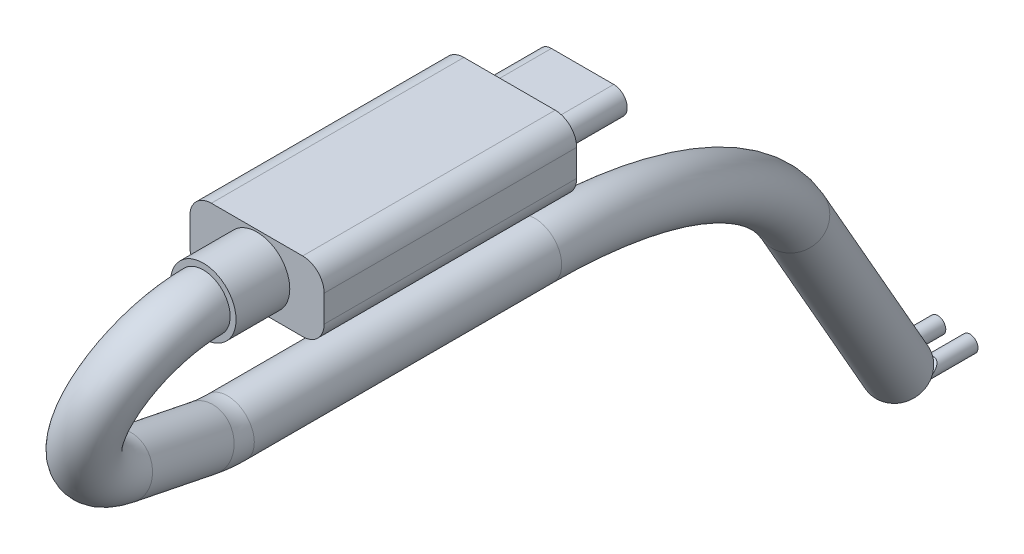
ISO-10303-21;
HEADER;
FILE_DESCRIPTION(('STEP AP214'),'2;1');
FILE_NAME('part.step','',(''),(''),'','','');
FILE_SCHEMA(('AUTOMOTIVE_DESIGN { 1 0 10303 214 1 1 1 1 }'));
ENDSEC;
DATA;
#1=APPLICATION_CONTEXT('core data for automotive mechanical design processes');
#2=APPLICATION_PROTOCOL_DEFINITION('international standard','automotive_design',2000,#1);
#3=PRODUCT_CONTEXT('',#1,'mechanical');
#4=PRODUCT('Part','Part','',(#3));
#5=PRODUCT_RELATED_PRODUCT_CATEGORY('part','',(#4));
#6=PRODUCT_DEFINITION_FORMATION('','',#4);
#7=PRODUCT_DEFINITION_CONTEXT('part definition',#1,'design');
#8=PRODUCT_DEFINITION('design','',#6,#7);
#9=PRODUCT_DEFINITION_SHAPE('','',#8);
#10=(LENGTH_UNIT() NAMED_UNIT(*) SI_UNIT(.MILLI.,.METRE.));
#11=(NAMED_UNIT(*) PLANE_ANGLE_UNIT() SI_UNIT($,.RADIAN.));
#12=(NAMED_UNIT(*) SI_UNIT($,.STERADIAN.) SOLID_ANGLE_UNIT());
#13=UNCERTAINTY_MEASURE_WITH_UNIT(LENGTH_MEASURE(1.E-05),#10,'distance_accuracy_value','');
#14=(GEOMETRIC_REPRESENTATION_CONTEXT(3) GLOBAL_UNCERTAINTY_ASSIGNED_CONTEXT((#13)) GLOBAL_UNIT_ASSIGNED_CONTEXT((#10,
#11,#12)) REPRESENTATION_CONTEXT('',''));
#15=CARTESIAN_POINT('',(0.,0.,0.));
#16=DIRECTION('',(0.,0.,1.));
#17=DIRECTION('',(1.,0.,0.));
#18=AXIS2_PLACEMENT_3D('',#15,#16,#17);
#19=CARTESIAN_POINT('',(-22.1484523727716,-58.2448093046502,-64.166177989966));
#20=DIRECTION('',(0.,0.,1.));
#21=DIRECTION('',(1.,0.,0.));
#22=AXIS2_PLACEMENT_3D('',#19,#20,#21);
#23=CYLINDRICAL_SURFACE('',#22,0.749999999999999);
#24=CARTESIAN_POINT('',(-22.3990542849047,-58.951702989468,-54.827923588188));
#25=CARTESIAN_POINT('',(-23.8128416545402,-58.4504991652018,-54.827923588188));
#26=CARTESIAN_POINT('',(-23.311637830274,-57.0367117955663,-57.0301176485129));
#27=CARTESIAN_POINT('',(-21.8978504606385,-57.5379156198325,-57.0301176485129));
#28=CARTESIAN_POINT('',(-20.484063091003,-58.0391194440987,-57.0301176485129));
#29=CARTESIAN_POINT('',(-20.9852669152692,-59.4529068137342,-54.827923588188));
#30=CARTESIAN_POINT('',(-22.3990542849047,-58.951702989468,-54.827923588188));
#31=(BOUNDED_CURVE() B_SPLINE_CURVE(3,(#24,#25,#26,#27,#28,#29,#30),.UNSPECIFIED.,.T.,
.F.) B_SPLINE_CURVE_WITH_KNOTS((4,3,4),(0.,0.5,1.),
.UNSPECIFIED.) CURVE() GEOMETRIC_REPRESENTATION_ITEM() RATIONAL_B_SPLINE_CURVE((1.,
0.333333333333333,0.333333333333333,1.,0.333333333333333,0.333333333333333,1.)) REPRESENTATION_ITEM(''));
#32=CARTESIAN_POINT('',(-22.3990542849047,-58.951702989468,-54.827923588188));
#33=VERTEX_POINT('',#32);
#34=EDGE_CURVE('E60',#33,#33,#31,.T.);
#35=ORIENTED_EDGE('',*,*,#34,.T.);
#36=EDGE_LOOP('',(#35));
#37=FACE_BOUND('',#36,.T.);
#38=CARTESIAN_POINT('',(-22.1484523727716,-58.2448093046502,-62.));
#39=DIRECTION('',(0.,0.,-1.));
#40=DIRECTION('',(-1.,0.,0.));
#41=AXIS2_PLACEMENT_3D('',#38,#39,#40);
#42=CIRCLE('',#41,0.749999999999999);
#43=CARTESIAN_POINT('',(-22.8984523727716,-58.2448093046502,-62.));
#44=VERTEX_POINT('',#43);
#45=EDGE_CURVE('E11',#44,#44,#42,.T.);
#46=ORIENTED_EDGE('',*,*,#45,.F.);
#47=EDGE_LOOP('',(#46));
#48=FACE_BOUND('',#47,.T.);
#49=ADVANCED_FACE('F53',(#37,#48),#23,.T.);
#50=CARTESIAN_POINT('',(-21.8978504606385,-57.5379156198325,-57.0301176485129));
#51=DIRECTION('',(0.276159487991269,0.778986067591778,0.562953500468998));
#52=DIRECTION('',(0.,-0.585731531678634,0.81050513434364));
#53=AXIS2_PLACEMENT_3D('',#50,#51,#52);
#54=PLANE('',#53);
#55=ORIENTED_EDGE('',*,*,#34,.F.);
#56=EDGE_LOOP('',(#55));
#57=FACE_BOUND('',#56,.T.);
#58=ADVANCED_FACE('F73',(#57),#54,.T.);
#59=CARTESIAN_POINT('',(0.,0.,-62.));
#60=DIRECTION('',(0.,0.,-1.));
#61=DIRECTION('',(-1.,0.,0.));
#62=AXIS2_PLACEMENT_3D('',#59,#60,#61);
#63=PLANE('',#62);
#64=ORIENTED_EDGE('',*,*,#45,.T.);
#65=EDGE_LOOP('',(#64));
#66=FACE_BOUND('',#65,.T.);
#67=ADVANCED_FACE('F55',(#66),#63,.T.);
#68=CLOSED_SHELL('',(#49,#58,#67));
#69=MANIFOLD_SOLID_BREP('B2',#68);
#70=CARTESIAN_POINT('',(-19.1484523727716,-58.2448093046502,-65.6378421025803));
#71=DIRECTION('',(0.,0.,1.));
#72=DIRECTION('',(1.,0.,0.));
#73=AXIS2_PLACEMENT_3D('',#70,#71,#72);
#74=CYLINDRICAL_SURFACE('',#73,0.749999999999999);
#75=CARTESIAN_POINT('',(-19.3990542849047,-58.951702989468,-56.2995877008023));
#76=CARTESIAN_POINT('',(-20.8128416545402,-58.4504991652018,-56.2995877008023));
#77=CARTESIAN_POINT('',(-20.311637830274,-57.0367117955663,-58.5017817611271));
#78=CARTESIAN_POINT('',(-18.8978504606385,-57.5379156198325,-58.5017817611271));
#79=CARTESIAN_POINT('',(-17.484063091003,-58.0391194440987,-58.5017817611271));
#80=CARTESIAN_POINT('',(-17.9852669152692,-59.4529068137342,-56.2995877008023));
#81=CARTESIAN_POINT('',(-19.3990542849047,-58.951702989468,-56.2995877008023));
#82=(BOUNDED_CURVE() B_SPLINE_CURVE(3,(#75,#76,#77,#78,#79,#80,#81),.UNSPECIFIED.,.T.,
.F.) B_SPLINE_CURVE_WITH_KNOTS((4,3,4),(0.,0.5,1.),
.UNSPECIFIED.) CURVE() GEOMETRIC_REPRESENTATION_ITEM() RATIONAL_B_SPLINE_CURVE((1.,
0.333333333333333,0.333333333333333,1.,0.333333333333333,0.333333333333333,1.)) REPRESENTATION_ITEM(''));
#83=CARTESIAN_POINT('',(-19.3990542849047,-58.951702989468,-56.2995877008023));
#84=VERTEX_POINT('',#83);
#85=EDGE_CURVE('E114',#84,#84,#82,.T.);
#86=ORIENTED_EDGE('',*,*,#85,.T.);
#87=EDGE_LOOP('',(#86));
#88=FACE_BOUND('',#87,.T.);
#89=CARTESIAN_POINT('',(-19.1484523727716,-58.2448093046502,-62.));
#90=DIRECTION('',(0.,0.,-1.));
#91=DIRECTION('',(-1.,0.,0.));
#92=AXIS2_PLACEMENT_3D('',#89,#90,#91);
#93=CIRCLE('',#92,0.749999999999999);
#94=CARTESIAN_POINT('',(-19.8984523727716,-58.2448093046502,-62.));
#95=VERTEX_POINT('',#94);
#96=EDGE_CURVE('E52',#95,#95,#93,.T.);
#97=ORIENTED_EDGE('',*,*,#96,.F.);
#98=EDGE_LOOP('',(#97));
#99=FACE_BOUND('',#98,.T.);
#100=ADVANCED_FACE('F107',(#88,#99),#74,.T.);
#101=CARTESIAN_POINT('',(-18.8978504606385,-57.5379156198325,-58.5017817611271));
#102=DIRECTION('',(0.276159487991267,0.778986067591777,0.562953500469));
#103=DIRECTION('',(0.,-0.585731531678636,0.810505134343638));
#104=AXIS2_PLACEMENT_3D('',#101,#102,#103);
#105=PLANE('',#104);
#106=ORIENTED_EDGE('',*,*,#85,.F.);
#107=EDGE_LOOP('',(#106));
#108=FACE_BOUND('',#107,.T.);
#109=ADVANCED_FACE('F127',(#108),#105,.T.);
#110=CARTESIAN_POINT('',(0.,0.,-62.));
#111=DIRECTION('',(0.,0.,-1.));
#112=DIRECTION('',(-1.,0.,0.));
#113=AXIS2_PLACEMENT_3D('',#110,#111,#112);
#114=PLANE('',#113);
#115=ORIENTED_EDGE('',*,*,#96,.T.);
#116=EDGE_LOOP('',(#115));
#117=FACE_BOUND('',#116,.T.);
#118=ADVANCED_FACE('F109',(#117),#114,.T.);
#119=CLOSED_SHELL('',(#100,#109,#118));
#120=MANIFOLD_SOLID_BREP('B6',#119);
#121=CARTESIAN_POINT('',(-2.9,0.,-6.8));
#122=DIRECTION('',(0.,0.,1.));
#123=DIRECTION('',(1.,0.,0.));
#124=AXIS2_PLACEMENT_3D('',#121,#122,#123);
#125=CYLINDRICAL_SURFACE('',#124,1.25);
#126=DIRECTION('',(0.,0.,1.));
#127=VECTOR('',#126,1.);
#128=CARTESIAN_POINT('',(-2.9,1.25,-6.8));
#129=LINE('',#128,#127);
#130=CARTESIAN_POINT('',(-2.9,1.25,-6.8));
#131=VERTEX_POINT('',#130);
#132=CARTESIAN_POINT('',(-2.9,1.25,0.));
#133=VERTEX_POINT('',#132);
#134=EDGE_CURVE('E297',#131,#133,#129,.T.);
#135=ORIENTED_EDGE('',*,*,#134,.F.);
#136=CARTESIAN_POINT('',(-2.9,0.,-6.8));
#137=DIRECTION('',(0.,0.,-1.));
#138=DIRECTION('',(-1.,0.,0.));
#139=AXIS2_PLACEMENT_3D('',#136,#137,#138);
#140=CIRCLE('',#139,1.25);
#141=CARTESIAN_POINT('',(-2.9,-1.25,-6.8));
#142=VERTEX_POINT('',#141);
#143=EDGE_CURVE('E303',#142,#131,#140,.T.);
#144=ORIENTED_EDGE('',*,*,#143,.F.);
#145=DIRECTION('',(0.,0.,1.));
#146=VECTOR('',#145,1.);
#147=CARTESIAN_POINT('',(-2.9,-1.25,-6.8));
#148=LINE('',#147,#146);
#149=CARTESIAN_POINT('',(-2.9,-1.25,0.));
#150=VERTEX_POINT('',#149);
#151=EDGE_CURVE('E300',#150,#142,#148,.F.);
#152=ORIENTED_EDGE('',*,*,#151,.F.);
#153=CARTESIAN_POINT('',(-2.9,0.,0.));
#154=DIRECTION('',(0.,0.,-1.));
#155=DIRECTION('',(-1.,0.,0.));
#156=AXIS2_PLACEMENT_3D('',#153,#154,#155);
#157=CIRCLE('',#156,1.25);
#158=EDGE_CURVE('E305',#150,#133,#157,.T.);
#159=ORIENTED_EDGE('',*,*,#158,.T.);
#160=EDGE_LOOP('',(#135,#144,#152,#159));
#161=FACE_BOUND('',#160,.T.);
#162=ADVANCED_FACE('F152',(#161),#125,.T.);
#163=CARTESIAN_POINT('',(2.9,0.,0.));
#164=DIRECTION('',(0.,0.,1.));
#165=DIRECTION('',(1.,0.,0.));
#166=AXIS2_PLACEMENT_3D('',#163,#164,#165);
#167=CYLINDRICAL_SURFACE('',#166,1.25);
#168=DIRECTION('',(0.,0.,1.));
#169=VECTOR('',#168,1.);
#170=CARTESIAN_POINT('',(2.9,1.25,-6.8));
#171=LINE('',#170,#169);
#172=CARTESIAN_POINT('',(2.9,1.25,0.));
#173=VERTEX_POINT('',#172);
#174=CARTESIAN_POINT('',(2.9,1.25,-6.8));
#175=VERTEX_POINT('',#174);
#176=EDGE_CURVE('E285',#173,#175,#171,.F.);
#177=ORIENTED_EDGE('',*,*,#176,.F.);
#178=CARTESIAN_POINT('',(2.9,0.,0.));
#179=DIRECTION('',(0.,0.,-1.));
#180=DIRECTION('',(-1.,0.,0.));
#181=AXIS2_PLACEMENT_3D('',#178,#179,#180);
#182=CIRCLE('',#181,1.25);
#183=CARTESIAN_POINT('',(2.9,-1.25,0.));
#184=VERTEX_POINT('',#183);
#185=EDGE_CURVE('E294',#173,#184,#182,.T.);
#186=ORIENTED_EDGE('',*,*,#185,.T.);
#187=DIRECTION('',(0.,0.,1.));
#188=VECTOR('',#187,1.);
#189=CARTESIAN_POINT('',(2.9,-1.25,-6.8));
#190=LINE('',#189,#188);
#191=CARTESIAN_POINT('',(2.9,-1.25,-6.8));
#192=VERTEX_POINT('',#191);
#193=EDGE_CURVE('E288',#192,#184,#190,.T.);
#194=ORIENTED_EDGE('',*,*,#193,.F.);
#195=CARTESIAN_POINT('',(2.9,0.,-6.8));
#196=DIRECTION('',(0.,0.,-1.));
#197=DIRECTION('',(-1.,0.,0.));
#198=AXIS2_PLACEMENT_3D('',#195,#196,#197);
#199=CIRCLE('',#198,1.25);
#200=EDGE_CURVE('E291',#175,#192,#199,.T.);
#201=ORIENTED_EDGE('',*,*,#200,.F.);
#202=EDGE_LOOP('',(#177,#186,#194,#201));
#203=FACE_BOUND('',#202,.T.);
#204=ADVANCED_FACE('F376',(#203),#167,.T.);
#205=CARTESIAN_POINT('',(0.,0.,0.));
#206=DIRECTION('',(0.,0.,-1.));
#207=DIRECTION('',(-1.,0.,0.));
#208=AXIS2_PLACEMENT_3D('',#205,#206,#207);
#209=PLANE('',#208);
#210=ORIENTED_EDGE('',*,*,#158,.F.);
#211=DIRECTION('',(1.,0.,0.));
#212=VECTOR('',#211,1.);
#213=CARTESIAN_POINT('',(-4.15,-1.25,0.));
#214=LINE('',#213,#212);
#215=EDGE_CURVE('E594',#150,#184,#214,.T.);
#216=ORIENTED_EDGE('',*,*,#215,.T.);
#217=ORIENTED_EDGE('',*,*,#185,.F.);
#218=DIRECTION('',(-1.,0.,0.));
#219=VECTOR('',#218,1.);
#220=CARTESIAN_POINT('',(-4.15,1.25,0.));
#221=LINE('',#220,#219);
#222=EDGE_CURVE('E596',#173,#133,#221,.T.);
#223=ORIENTED_EDGE('',*,*,#222,.T.);
#224=EDGE_LOOP('',(#210,#216,#217,#223));
#225=FACE_BOUND('',#224,.T.);
#226=DIRECTION('',(0.,-1.,0.));
#227=VECTOR('',#226,1.);
#228=CARTESIAN_POINT('',(-6.25,-3.25,0.));
#229=LINE('',#228,#227);
#230=CARTESIAN_POINT('',(-6.25,1.25,0.));
#231=VERTEX_POINT('',#230);
#232=CARTESIAN_POINT('',(-6.25,-1.25,0.));
#233=VERTEX_POINT('',#232);
#234=EDGE_CURVE('E279',#231,#233,#229,.T.);
#235=ORIENTED_EDGE('',*,*,#234,.F.);
#236=CARTESIAN_POINT('',(-4.25,1.25,0.));
#237=DIRECTION('',(0.,0.,-1.));
#238=DIRECTION('',(-1.,0.,0.));
#239=AXIS2_PLACEMENT_3D('',#236,#237,#238);
#240=CIRCLE('',#239,2.);
#241=CARTESIAN_POINT('',(-4.25,3.25,0.));
#242=VERTEX_POINT('',#241);
#243=EDGE_CURVE('E318',#231,#242,#240,.T.);
#244=ORIENTED_EDGE('',*,*,#243,.T.);
#245=DIRECTION('',(-1.,0.,0.));
#246=VECTOR('',#245,1.);
#247=CARTESIAN_POINT('',(-6.25,3.25,0.));
#248=LINE('',#247,#246);
#249=CARTESIAN_POINT('',(4.25,3.25,0.));
#250=VERTEX_POINT('',#249);
#251=EDGE_CURVE('E276',#250,#242,#248,.T.);
#252=ORIENTED_EDGE('',*,*,#251,.F.);
#253=CARTESIAN_POINT('',(4.25,1.25,0.));
#254=DIRECTION('',(0.,0.,-1.));
#255=DIRECTION('',(-1.,0.,0.));
#256=AXIS2_PLACEMENT_3D('',#253,#254,#255);
#257=CIRCLE('',#256,2.);
#258=CARTESIAN_POINT('',(6.25,1.25,0.));
#259=VERTEX_POINT('',#258);
#260=EDGE_CURVE('E312',#250,#259,#257,.T.);
#261=ORIENTED_EDGE('',*,*,#260,.T.);
#262=DIRECTION('',(0.,1.,0.));
#263=VECTOR('',#262,1.);
#264=CARTESIAN_POINT('',(6.25,-3.25,0.));
#265=LINE('',#264,#263);
#266=CARTESIAN_POINT('',(6.25,-1.25,0.));
#267=VERTEX_POINT('',#266);
#268=EDGE_CURVE('E252',#267,#259,#265,.T.);
#269=ORIENTED_EDGE('',*,*,#268,.F.);
#270=CARTESIAN_POINT('',(4.25,-1.25,0.));
#271=DIRECTION('',(0.,0.,-1.));
#272=DIRECTION('',(-1.,0.,0.));
#273=AXIS2_PLACEMENT_3D('',#270,#271,#272);
#274=CIRCLE('',#273,2.);
#275=CARTESIAN_POINT('',(4.25,-3.25,0.));
#276=VERTEX_POINT('',#275);
#277=EDGE_CURVE('E314',#267,#276,#274,.T.);
#278=ORIENTED_EDGE('',*,*,#277,.T.);
#279=DIRECTION('',(1.,0.,0.));
#280=VECTOR('',#279,1.);
#281=CARTESIAN_POINT('',(-6.25,-3.25,0.));
#282=LINE('',#281,#280);
#283=CARTESIAN_POINT('',(-4.25,-3.25,0.));
#284=VERTEX_POINT('',#283);
#285=EDGE_CURVE('E268',#284,#276,#282,.T.);
#286=ORIENTED_EDGE('',*,*,#285,.F.);
#287=CARTESIAN_POINT('',(-4.25,-1.25,0.));
#288=DIRECTION('',(0.,0.,-1.));
#289=DIRECTION('',(-1.,0.,0.));
#290=AXIS2_PLACEMENT_3D('',#287,#288,#289);
#291=CIRCLE('',#290,2.);
#292=EDGE_CURVE('E316',#284,#233,#291,.T.);
#293=ORIENTED_EDGE('',*,*,#292,.T.);
#294=EDGE_LOOP('',(#235,#244,#252,#261,#269,#278,#286,#293));
#295=FACE_BOUND('',#294,.T.);
#296=ADVANCED_FACE('F353',(#225,#295),#209,.T.);
#297=CARTESIAN_POINT('',(6.25,-3.25,23.5));
#298=DIRECTION('',(-1.,0.,0.));
#299=DIRECTION('',(0.,0.,1.));
#300=AXIS2_PLACEMENT_3D('',#297,#298,#299);
#301=PLANE('',#300);
#302=DIRECTION('',(0.,1.,0.));
#303=VECTOR('',#302,1.);
#304=CARTESIAN_POINT('',(6.25,-3.25,23.5));
#305=LINE('',#304,#303);
#306=CARTESIAN_POINT('',(6.25,-1.25,23.5));
#307=VERTEX_POINT('',#306);
#308=CARTESIAN_POINT('',(6.25,1.25,23.5));
#309=VERTEX_POINT('',#308);
#310=EDGE_CURVE('E264',#307,#309,#305,.T.);
#311=ORIENTED_EDGE('',*,*,#310,.F.);
#312=DIRECTION('',(0.,0.,-1.));
#313=VECTOR('',#312,1.);
#314=CARTESIAN_POINT('',(6.25,-1.25,23.5));
#315=LINE('',#314,#313);
#316=EDGE_CURVE('E105',#307,#267,#315,.T.);
#317=ORIENTED_EDGE('',*,*,#316,.T.);
#318=ORIENTED_EDGE('',*,*,#268,.T.);
#319=DIRECTION('',(0.,0.,-1.));
#320=VECTOR('',#319,1.);
#321=CARTESIAN_POINT('',(6.25,1.25,23.5));
#322=LINE('',#321,#320);
#323=EDGE_CURVE('E160',#259,#309,#322,.F.);
#324=ORIENTED_EDGE('',*,*,#323,.T.);
#325=EDGE_LOOP('',(#311,#317,#318,#324));
#326=FACE_BOUND('',#325,.T.);
#327=ADVANCED_FACE('F338',(#326),#301,.F.);
#328=CARTESIAN_POINT('',(-6.25000000000001,3.25,23.5));
#329=DIRECTION('',(0.,-1.,0.));
#330=DIRECTION('',(0.,0.,-1.));
#331=AXIS2_PLACEMENT_3D('',#328,#329,#330);
#332=PLANE('',#331);
#333=ORIENTED_EDGE('',*,*,#251,.T.);
#334=DIRECTION('',(0.,0.,-1.));
#335=VECTOR('',#334,1.);
#336=CARTESIAN_POINT('',(-4.25000000000001,3.25,23.5));
#337=LINE('',#336,#335);
#338=CARTESIAN_POINT('',(-4.25000000000001,3.25,23.5));
#339=VERTEX_POINT('',#338);
#340=EDGE_CURVE('E323',#242,#339,#337,.F.);
#341=ORIENTED_EDGE('',*,*,#340,.T.);
#342=DIRECTION('',(-1.,0.,0.));
#343=VECTOR('',#342,1.);
#344=CARTESIAN_POINT('',(-6.25000000000001,3.25,23.5));
#345=LINE('',#344,#343);
#346=CARTESIAN_POINT('',(4.25,3.25,23.5));
#347=VERTEX_POINT('',#346);
#348=EDGE_CURVE('E267',#347,#339,#345,.T.);
#349=ORIENTED_EDGE('',*,*,#348,.F.);
#350=DIRECTION('',(0.,0.,-1.));
#351=VECTOR('',#350,1.);
#352=CARTESIAN_POINT('',(4.25,3.25,23.5));
#353=LINE('',#352,#351);
#354=EDGE_CURVE('E320',#347,#250,#353,.T.);
#355=ORIENTED_EDGE('',*,*,#354,.T.);
#356=EDGE_LOOP('',(#333,#341,#349,#355));
#357=FACE_BOUND('',#356,.T.);
#358=ADVANCED_FACE('F349',(#357),#332,.F.);
#359=CARTESIAN_POINT('',(-6.25000000000001,-3.25,23.5));
#360=DIRECTION('',(1.,0.,0.));
#361=DIRECTION('',(0.,0.,-1.));
#362=AXIS2_PLACEMENT_3D('',#359,#360,#361);
#363=PLANE('',#362);
#364=DIRECTION('',(0.,-1.,0.));
#365=VECTOR('',#364,1.);
#366=CARTESIAN_POINT('',(-6.25000000000001,-3.25,23.5));
#367=LINE('',#366,#365);
#368=CARTESIAN_POINT('',(-6.25000000000001,1.25,23.5));
#369=VERTEX_POINT('',#368);
#370=CARTESIAN_POINT('',(-6.25000000000001,-1.25,23.5));
#371=VERTEX_POINT('',#370);
#372=EDGE_CURVE('E271',#369,#371,#367,.T.);
#373=ORIENTED_EDGE('',*,*,#372,.F.);
#374=DIRECTION('',(0.,0.,-1.));
#375=VECTOR('',#374,1.);
#376=CARTESIAN_POINT('',(-6.25000000000001,1.25,23.5));
#377=LINE('',#376,#375);
#378=EDGE_CURVE('E309',#369,#231,#377,.T.);
#379=ORIENTED_EDGE('',*,*,#378,.T.);
#380=ORIENTED_EDGE('',*,*,#234,.T.);
#381=DIRECTION('',(0.,0.,-1.));
#382=VECTOR('',#381,1.);
#383=CARTESIAN_POINT('',(-6.25000000000001,-1.25,23.5));
#384=LINE('',#383,#382);
#385=EDGE_CURVE('E307',#233,#371,#384,.F.);
#386=ORIENTED_EDGE('',*,*,#385,.T.);
#387=EDGE_LOOP('',(#373,#379,#380,#386));
#388=FACE_BOUND('',#387,.T.);
#389=ADVANCED_FACE('F360',(#388),#363,.F.);
#390=CARTESIAN_POINT('',(-6.25000000000001,-3.25,23.5));
#391=DIRECTION('',(0.,1.,0.));
#392=DIRECTION('',(0.,0.,1.));
#393=AXIS2_PLACEMENT_3D('',#390,#391,#392);
#394=PLANE('',#393);
#395=DIRECTION('',(1.,0.,0.));
#396=VECTOR('',#395,1.);
#397=CARTESIAN_POINT('',(-6.25000000000001,-3.25,23.5));
#398=LINE('',#397,#396);
#399=CARTESIAN_POINT('',(-4.25000000000001,-3.25,23.5));
#400=VERTEX_POINT('',#399);
#401=CARTESIAN_POINT('',(4.25,-3.25,23.5));
#402=VERTEX_POINT('',#401);
#403=EDGE_CURVE('E263',#400,#402,#398,.T.);
#404=ORIENTED_EDGE('',*,*,#403,.F.);
#405=DIRECTION('',(0.,0.,-1.));
#406=VECTOR('',#405,1.);
#407=CARTESIAN_POINT('',(-4.25000000000001,-3.25,23.5));
#408=LINE('',#407,#406);
#409=EDGE_CURVE('E333',#400,#284,#408,.T.);
#410=ORIENTED_EDGE('',*,*,#409,.T.);
#411=ORIENTED_EDGE('',*,*,#285,.T.);
#412=DIRECTION('',(0.,0.,-1.));
#413=VECTOR('',#412,1.);
#414=CARTESIAN_POINT('',(4.25,-3.25,23.5));
#415=LINE('',#414,#413);
#416=EDGE_CURVE('E167',#276,#402,#415,.F.);
#417=ORIENTED_EDGE('',*,*,#416,.T.);
#418=EDGE_LOOP('',(#404,#410,#411,#417));
#419=FACE_BOUND('',#418,.T.);
#420=ADVANCED_FACE('F366',(#419),#394,.F.);
#421=CARTESIAN_POINT('',(0.,0.,23.5));
#422=DIRECTION('',(0.,0.,-1.));
#423=DIRECTION('',(-1.,0.,0.));
#424=AXIS2_PLACEMENT_3D('',#421,#422,#423);
#425=PLANE('',#424);
#426=CARTESIAN_POINT('',(0.,0.,23.5));
#427=DIRECTION('',(0.,0.,1.));
#428=DIRECTION('',(1.,0.,0.));
#429=AXIS2_PLACEMENT_3D('',#426,#427,#428);
#430=CIRCLE('',#429,3.05);
#431=CARTESIAN_POINT('',(3.05,0.,23.5));
#432=VERTEX_POINT('',#431);
#433=EDGE_CURVE('E259',#432,#432,#430,.T.);
#434=ORIENTED_EDGE('',*,*,#433,.F.);
#435=EDGE_LOOP('',(#434));
#436=FACE_BOUND('',#435,.T.);
#437=ORIENTED_EDGE('',*,*,#348,.T.);
#438=CARTESIAN_POINT('',(-4.25000000000001,1.25,23.5));
#439=DIRECTION('',(0.,0.,-1.));
#440=DIRECTION('',(-1.,0.,0.));
#441=AXIS2_PLACEMENT_3D('',#438,#439,#440);
#442=CIRCLE('',#441,2.);
#443=EDGE_CURVE('E330',#339,#369,#442,.F.);
#444=ORIENTED_EDGE('',*,*,#443,.T.);
#445=ORIENTED_EDGE('',*,*,#372,.T.);
#446=CARTESIAN_POINT('',(-4.25000000000001,-1.25,23.5));
#447=DIRECTION('',(0.,0.,-1.));
#448=DIRECTION('',(-1.,0.,0.));
#449=AXIS2_PLACEMENT_3D('',#446,#447,#448);
#450=CIRCLE('',#449,2.);
#451=EDGE_CURVE('E174',#371,#400,#450,.F.);
#452=ORIENTED_EDGE('',*,*,#451,.T.);
#453=ORIENTED_EDGE('',*,*,#403,.T.);
#454=CARTESIAN_POINT('',(4.25,-1.25,23.5));
#455=DIRECTION('',(0.,0.,-1.));
#456=DIRECTION('',(-1.,0.,0.));
#457=AXIS2_PLACEMENT_3D('',#454,#455,#456);
#458=CIRCLE('',#457,2.);
#459=EDGE_CURVE('E327',#402,#307,#458,.F.);
#460=ORIENTED_EDGE('',*,*,#459,.T.);
#461=ORIENTED_EDGE('',*,*,#310,.T.);
#462=CARTESIAN_POINT('',(4.25,1.25,23.5));
#463=DIRECTION('',(0.,0.,-1.));
#464=DIRECTION('',(-1.,0.,0.));
#465=AXIS2_PLACEMENT_3D('',#462,#463,#464);
#466=CIRCLE('',#465,2.);
#467=EDGE_CURVE('E325',#309,#347,#466,.F.);
#468=ORIENTED_EDGE('',*,*,#467,.T.);
#469=EDGE_LOOP('',(#437,#444,#445,#452,#453,#460,#461,#468));
#470=FACE_BOUND('',#469,.T.);
#471=ADVANCED_FACE('F343',(#436,#470),#425,.F.);
#472=CARTESIAN_POINT('',(0.,0.,28.5));
#473=DIRECTION('',(0.,0.,-1.));
#474=DIRECTION('',(-1.,0.,0.));
#475=AXIS2_PLACEMENT_3D('',#472,#473,#474);
#476=CYLINDRICAL_SURFACE('',#475,3.05);
#477=CARTESIAN_POINT('',(0.,0.,28.5));
#478=DIRECTION('',(0.,0.,1.));
#479=DIRECTION('',(1.,0.,0.));
#480=AXIS2_PLACEMENT_3D('',#477,#478,#479);
#481=CIRCLE('',#480,3.05);
#482=CARTESIAN_POINT('',(3.05,0.,28.5));
#483=VERTEX_POINT('',#482);
#484=EDGE_CURVE('E248',#483,#483,#481,.T.);
#485=ORIENTED_EDGE('',*,*,#484,.F.);
#486=EDGE_LOOP('',(#485));
#487=FACE_BOUND('',#486,.T.);
#488=ORIENTED_EDGE('',*,*,#433,.T.);
#489=EDGE_LOOP('',(#488));
#490=FACE_BOUND('',#489,.T.);
#491=ADVANCED_FACE('F438',(#487,#490),#476,.T.);
#492=CARTESIAN_POINT('',(0.,0.,28.5));
#493=DIRECTION('',(0.,0.,1.));
#494=DIRECTION('',(1.,0.,0.));
#495=AXIS2_PLACEMENT_3D('',#492,#493,#494);
#496=PLANE('',#495);
#497=CARTESIAN_POINT('',(0.,0.,28.5));
#498=DIRECTION('',(0.,0.,1.));
#499=DIRECTION('',(1.,0.,0.));
#500=AXIS2_PLACEMENT_3D('',#497,#498,#499);
#501=CIRCLE('',#500,2.5);
#502=CARTESIAN_POINT('',(0.835339707110308,2.35631228272589,28.5));
#503=VERTEX_POINT('',#502);
#504=EDGE_CURVE('E262',#503,#503,#501,.T.);
#505=ORIENTED_EDGE('',*,*,#504,.F.);
#506=EDGE_LOOP('',(#505));
#507=FACE_BOUND('',#506,.T.);
#508=ORIENTED_EDGE('',*,*,#484,.T.);
#509=EDGE_LOOP('',(#508));
#510=FACE_BOUND('',#509,.T.);
#511=ADVANCED_FACE('F433',(#507,#510),#496,.T.);
#512=CARTESIAN_POINT('',(-20.6484523727716,-58.2448093046502,-56.6648526749525));
#513=DIRECTION('',(-0.276159487991271,-0.778986067591776,-0.562953500469));
#514=DIRECTION('',(0.825501261560404,-0.492223124563018,0.276159487991271));
#515=AXIS2_PLACEMENT_3D('',#512,#513,#514);
#516=PLANE('',#515);
#517=CARTESIAN_POINT('',(-20.6484523727716,-58.2448093046502,-56.6648526749525));
#518=DIRECTION('',(-0.276159487991271,-0.778986067591776,-0.562953500469));
#519=DIRECTION('',(0.825501261560404,-0.492223124563018,0.276159487991271));
#520=AXIS2_PLACEMENT_3D('',#517,#518,#519);
#521=CIRCLE('',#520,2.5);
#522=CARTESIAN_POINT('',(-18.5846992188706,-59.4753671160578,-55.9744539549743));
#523=VERTEX_POINT('',#522);
#524=EDGE_CURVE('E245',#523,#523,#521,.T.);
#525=ORIENTED_EDGE('',*,*,#524,.T.);
#526=EDGE_LOOP('',(#525));
#527=FACE_BOUND('',#526,.T.);
#528=ADVANCED_FACE('F246',(#527),#516,.T.);
#529=CARTESIAN_POINT('',(-2.67308706275298,-7.54019930472283,28.5));
#530=DIRECTION('',(0.942524913090354,-0.334135882844122,0.));
#531=DIRECTION('',(0.334135882844122,0.942524913090354,0.));
#532=AXIS2_PLACEMENT_3D('',#529,#530,#531);
#533=TOROIDAL_SURFACE('',#532,8.,2.5);
#534=CARTESIAN_POINT('',(-5.2343524719455,-14.7649739582332,30.7896617020138));
#535=DIRECTION('',(-0.0956322667770929,-0.269757899587104,-0.958167597636984));
#536=DIRECTION('',(0.781376876958647,-0.616688451088089,0.0956322667770929));
#537=AXIS2_PLACEMENT_3D('',#534,#535,#536);
#538=CIRCLE('',#537,2.5);
#539=CARTESIAN_POINT('',(-6.03474791231816,-17.0227160374551,31.5051809838931));
#540=VERTEX_POINT('',#539);
#541=EDGE_CURVE('E606',#540,#540,#538,.T.);
#542=CARTESIAN_POINT('',(-2.67308706275298,-7.54019930472283,28.5));
#543=DIRECTION('',(0.942524913090354,-0.334135882844122,0.));
#544=DIRECTION('',(0.334135882844122,0.942524913090354,0.));
#545=AXIS2_PLACEMENT_3D('',#542,#543,#544);
#546=CIRCLE('',#545,10.5);
#547=EDGE_CURVE('',#503,#540,#546,.T.);
#548=ORIENTED_EDGE('',*,*,#504,.T.);
#549=ORIENTED_EDGE('',*,*,#541,.F.);
#550=ORIENTED_EDGE('',*,*,#547,.T.);
#551=ORIENTED_EDGE('',*,*,#547,.F.);
#552=EDGE_LOOP('',(#548,#550,#549,#551));
#553=FACE_BOUND('',#552,.T.);
#554=ADVANCED_FACE('F411',(#553),#533,.T.);
#555=CARTESIAN_POINT('',(-5.2343524719455,-14.7649739582332,30.7896617020138));
#556=DIRECTION('',(-0.0956322667770929,-0.269757899587104,-0.958167597636984));
#557=DIRECTION('',(0.,0.962579357186375,-0.270999965163587));
#558=AXIS2_PLACEMENT_3D('',#555,#556,#557);
#559=CYLINDRICAL_SURFACE('',#558,2.5);
#560=CARTESIAN_POINT('',(-6.07637489671269,-17.1401367392208,22.3531932266174));
#561=DIRECTION('',(-0.0956322667770929,-0.269757899587104,-0.958167597636984));
#562=DIRECTION('',(0.781376876958647,-0.616688451088089,0.0956322667770928));
#563=AXIS2_PLACEMENT_3D('',#560,#561,#562);
#564=CIRCLE('',#563,2.5);
#565=CARTESIAN_POINT('',(-6.87677033708535,-19.3978788184428,23.0687125084967));
#566=VERTEX_POINT('',#565);
#567=EDGE_CURVE('E609',#566,#566,#564,.T.);
#568=ORIENTED_EDGE('',*,*,#567,.F.);
#569=EDGE_LOOP('',(#568));
#570=FACE_BOUND('',#569,.T.);
#571=ORIENTED_EDGE('',*,*,#541,.T.);
#572=EDGE_LOOP('',(#571));
#573=FACE_BOUND('',#572,.T.);
#574=ADVANCED_FACE('F414',(#570,#573),#559,.T.);
#575=CARTESIAN_POINT('',(-3.51510948752017,-9.91536208571052,20.0635315246036));
#576=DIRECTION('',(0.942524913090354,-0.334135882844122,0.));
#577=DIRECTION('',(0.334135882844122,0.942524913090354,0.));
#578=AXIS2_PLACEMENT_3D('',#575,#576,#577);
#579=TOROIDAL_SURFACE('',#578,8.,2.5);
#580=CARTESIAN_POINT('',(-6.18819655027315,-17.4555613904333,20.0635315246036));
#581=DIRECTION('',(0.,0.,-1.));
#582=DIRECTION('',(0.776706423591958,-0.62986278787605,0.));
#583=AXIS2_PLACEMENT_3D('',#580,#581,#582);
#584=CIRCLE('',#583,2.5);
#585=CARTESIAN_POINT('',(-7.02353625738345,-19.8118736731592,20.0635315246036));
#586=VERTEX_POINT('',#585);
#587=EDGE_CURVE('E612',#586,#586,#584,.T.);
#588=CARTESIAN_POINT('',(-3.51510948752017,-9.91536208571052,20.0635315246036));
#589=DIRECTION('',(0.942524913090354,-0.334135882844122,0.));
#590=DIRECTION('',(0.334135882844122,0.942524913090354,0.));
#591=AXIS2_PLACEMENT_3D('',#588,#589,#590);
#592=CIRCLE('',#591,10.5);
#593=EDGE_CURVE('',#566,#586,#592,.T.);
#594=ORIENTED_EDGE('',*,*,#567,.T.);
#595=ORIENTED_EDGE('',*,*,#587,.F.);
#596=ORIENTED_EDGE('',*,*,#593,.T.);
#597=ORIENTED_EDGE('',*,*,#593,.F.);
#598=EDGE_LOOP('',(#594,#596,#595,#597));
#599=FACE_BOUND('',#598,.T.);
#600=ADVANCED_FACE('F418',(#599),#579,.T.);
#601=CARTESIAN_POINT('',(-6.18819655027315,-17.4555613904333,20.0635315246036));
#602=DIRECTION('',(0.,0.,-1.));
#603=DIRECTION('',(0.,1.,0.));
#604=AXIS2_PLACEMENT_3D('',#601,#602,#603);
#605=CYLINDRICAL_SURFACE('',#604,2.5);
#606=CARTESIAN_POINT('',(-6.18819655027315,-17.4555613904333,-8.54215543868445));
#607=DIRECTION('',(0.,0.,-1.));
#608=DIRECTION('',(0.776706423591958,-0.62986278787605,0.));
#609=AXIS2_PLACEMENT_3D('',#606,#607,#608);
#610=CIRCLE('',#609,2.5);
#611=CARTESIAN_POINT('',(-5.35285684316284,-15.0992491077075,-8.54215543868445));
#612=VERTEX_POINT('',#611);
#613=EDGE_CURVE('E255',#612,#612,#610,.T.);
#614=ORIENTED_EDGE('',*,*,#613,.F.);
#615=EDGE_LOOP('',(#614));
#616=FACE_BOUND('',#615,.T.);
#617=ORIENTED_EDGE('',*,*,#587,.T.);
#618=EDGE_LOOP('',(#617));
#619=FACE_BOUND('',#618,.T.);
#620=ADVANCED_FACE('F422',(#616,#619),#605,.T.);
#621=CARTESIAN_POINT('',(-17.9697525222339,-50.6887775419646,-8.54215543868443));
#622=DIRECTION('',(-0.942524913090354,0.334135882844122,0.));
#623=DIRECTION('',(-0.334135882844122,-0.942524913090354,0.));
#624=AXIS2_PLACEMENT_3D('',#621,#622,#623);
#625=TOROIDAL_SURFACE('',#624,35.2597747709034,2.5);
#626=CARTESIAN_POINT('',(-11.3372843468471,-31.9800221776171,-37.6839562669504));
#627=DIRECTION('',(-0.276159487991271,-0.778986067591776,-0.562953500469001));
#628=DIRECTION('',(0.825501261560404,-0.492223124563018,0.276159487991271));
#629=AXIS2_PLACEMENT_3D('',#626,#627,#628);
#630=CIRCLE('',#629,2.5);
#631=CARTESIAN_POINT('',(-10.8670269346486,-30.6535279298585,-39.7501776919036));
#632=VERTEX_POINT('',#631);
#633=EDGE_CURVE('E249',#632,#632,#630,.T.);
#634=CARTESIAN_POINT('',(-17.9697525222339,-50.6887775419646,-8.54215543868443));
#635=DIRECTION('',(-0.942524913090354,0.334135882844122,0.));
#636=DIRECTION('',(-0.334135882844122,-0.942524913090354,0.));
#637=AXIS2_PLACEMENT_3D('',#634,#635,#636);
#638=CIRCLE('',#637,37.7597747709034);
#639=EDGE_CURVE('',#612,#632,#638,.T.);
#640=ORIENTED_EDGE('',*,*,#613,.T.);
#641=ORIENTED_EDGE('',*,*,#633,.F.);
#642=ORIENTED_EDGE('',*,*,#639,.T.);
#643=ORIENTED_EDGE('',*,*,#639,.F.);
#644=EDGE_LOOP('',(#640,#642,#641,#643));
#645=FACE_BOUND('',#644,.T.);
#646=ADVANCED_FACE('F426',(#645),#625,.T.);
#647=CARTESIAN_POINT('',(-11.3372843468471,-31.9800221776171,-37.6839562669504));
#648=DIRECTION('',(-0.276159487991271,-0.778986067591776,-0.562953500469));
#649=DIRECTION('',(0.,0.585731531678635,-0.810505134343638));
#650=AXIS2_PLACEMENT_3D('',#647,#648,#649);
#651=CYLINDRICAL_SURFACE('',#650,2.5);
#652=ORIENTED_EDGE('',*,*,#524,.F.);
#653=EDGE_LOOP('',(#652));
#654=FACE_BOUND('',#653,.T.);
#655=ORIENTED_EDGE('',*,*,#633,.T.);
#656=EDGE_LOOP('',(#655));
#657=FACE_BOUND('',#656,.T.);
#658=ADVANCED_FACE('F408',(#654,#657),#651,.T.);
#659=CARTESIAN_POINT('',(-4.15,-1.25,-6.8));
#660=DIRECTION('',(0.,-1.,0.));
#661=DIRECTION('',(0.,0.,-1.));
#662=AXIS2_PLACEMENT_3D('',#659,#660,#661);
#663=PLANE('',#662);
#664=ORIENTED_EDGE('',*,*,#215,.F.);
#665=ORIENTED_EDGE('',*,*,#151,.T.);
#666=DIRECTION('',(1.,0.,0.));
#667=VECTOR('',#666,1.);
#668=CARTESIAN_POINT('',(-4.15,-1.25,-6.8));
#669=LINE('',#668,#667);
#670=EDGE_CURVE('E601',#142,#192,#669,.T.);
#671=ORIENTED_EDGE('',*,*,#670,.T.);
#672=ORIENTED_EDGE('',*,*,#193,.T.);
#673=EDGE_LOOP('',(#664,#665,#671,#672));
#674=FACE_BOUND('',#673,.T.);
#675=ADVANCED_FACE('F402',(#674),#663,.T.);
#676=CARTESIAN_POINT('',(-4.15,1.25,-6.8));
#677=DIRECTION('',(0.,1.,0.));
#678=DIRECTION('',(0.,0.,1.));
#679=AXIS2_PLACEMENT_3D('',#676,#677,#678);
#680=PLANE('',#679);
#681=DIRECTION('',(-1.,0.,0.));
#682=VECTOR('',#681,1.);
#683=CARTESIAN_POINT('',(-4.15,1.25,-6.8));
#684=LINE('',#683,#682);
#685=EDGE_CURVE('E598',#175,#131,#684,.T.);
#686=ORIENTED_EDGE('',*,*,#685,.T.);
#687=ORIENTED_EDGE('',*,*,#134,.T.);
#688=ORIENTED_EDGE('',*,*,#222,.F.);
#689=ORIENTED_EDGE('',*,*,#176,.T.);
#690=EDGE_LOOP('',(#686,#687,#688,#689));
#691=FACE_BOUND('',#690,.T.);
#692=ADVANCED_FACE('F396',(#691),#680,.T.);
#693=CARTESIAN_POINT('',(0.,0.,-6.8));
#694=DIRECTION('',(0.,0.,-1.));
#695=DIRECTION('',(-1.,0.,0.));
#696=AXIS2_PLACEMENT_3D('',#693,#694,#695);
#697=PLANE('',#696);
#698=ORIENTED_EDGE('',*,*,#670,.F.);
#699=ORIENTED_EDGE('',*,*,#143,.T.);
#700=ORIENTED_EDGE('',*,*,#685,.F.);
#701=ORIENTED_EDGE('',*,*,#200,.T.);
#702=EDGE_LOOP('',(#698,#699,#700,#701));
#703=FACE_BOUND('',#702,.T.);
#704=ADVANCED_FACE('F392',(#703),#697,.T.);
#705=CARTESIAN_POINT('',(-4.25000000000001,1.25,23.5));
#706=DIRECTION('',(0.,0.,-1.));
#707=DIRECTION('',(-1.,0.,0.));
#708=AXIS2_PLACEMENT_3D('',#705,#706,#707);
#709=CYLINDRICAL_SURFACE('',#708,2.);
#710=ORIENTED_EDGE('',*,*,#443,.F.);
#711=ORIENTED_EDGE('',*,*,#340,.F.);
#712=ORIENTED_EDGE('',*,*,#243,.F.);
#713=ORIENTED_EDGE('',*,*,#378,.F.);
#714=EDGE_LOOP('',(#710,#711,#712,#713));
#715=FACE_BOUND('',#714,.T.);
#716=ADVANCED_FACE('F357',(#715),#709,.T.);
#717=CARTESIAN_POINT('',(-4.25000000000001,-1.25,23.5));
#718=DIRECTION('',(0.,0.,-1.));
#719=DIRECTION('',(-1.,0.,0.));
#720=AXIS2_PLACEMENT_3D('',#717,#718,#719);
#721=CYLINDRICAL_SURFACE('',#720,2.);
#722=ORIENTED_EDGE('',*,*,#451,.F.);
#723=ORIENTED_EDGE('',*,*,#385,.F.);
#724=ORIENTED_EDGE('',*,*,#292,.F.);
#725=ORIENTED_EDGE('',*,*,#409,.F.);
#726=EDGE_LOOP('',(#722,#723,#724,#725));
#727=FACE_BOUND('',#726,.T.);
#728=ADVANCED_FACE('F364',(#727),#721,.T.);
#729=CARTESIAN_POINT('',(4.25,-1.25,23.5));
#730=DIRECTION('',(0.,0.,-1.));
#731=DIRECTION('',(-1.,0.,0.));
#732=AXIS2_PLACEMENT_3D('',#729,#730,#731);
#733=CYLINDRICAL_SURFACE('',#732,2.);
#734=ORIENTED_EDGE('',*,*,#459,.F.);
#735=ORIENTED_EDGE('',*,*,#416,.F.);
#736=ORIENTED_EDGE('',*,*,#277,.F.);
#737=ORIENTED_EDGE('',*,*,#316,.F.);
#738=EDGE_LOOP('',(#734,#735,#736,#737));
#739=FACE_BOUND('',#738,.T.);
#740=ADVANCED_FACE('F368',(#739),#733,.T.);
#741=CARTESIAN_POINT('',(4.25,1.25,23.5));
#742=DIRECTION('',(0.,0.,-1.));
#743=DIRECTION('',(-1.,0.,0.));
#744=AXIS2_PLACEMENT_3D('',#741,#742,#743);
#745=CYLINDRICAL_SURFACE('',#744,2.);
#746=ORIENTED_EDGE('',*,*,#467,.F.);
#747=ORIENTED_EDGE('',*,*,#323,.F.);
#748=ORIENTED_EDGE('',*,*,#260,.F.);
#749=ORIENTED_EDGE('',*,*,#354,.F.);
#750=EDGE_LOOP('',(#746,#747,#748,#749));
#751=FACE_BOUND('',#750,.T.);
#752=ADVANCED_FACE('F154',(#751),#745,.T.);
#753=CLOSED_SHELL('',(#162,#204,#296,#327,#358,#389,#420,#471,#491,#511,#528,#554,#574,#600,
#620,#646,#658,#675,#692,#704,#716,#728,#740,#752));
#754=MANIFOLD_SOLID_BREP('B47',#753);
#755=ADVANCED_BREP_SHAPE_REPRESENTATION('',(#18,#69,#120,#754),#14);
#756=SHAPE_DEFINITION_REPRESENTATION(#9,#755);
ENDSEC;
END-ISO-10303-21;
